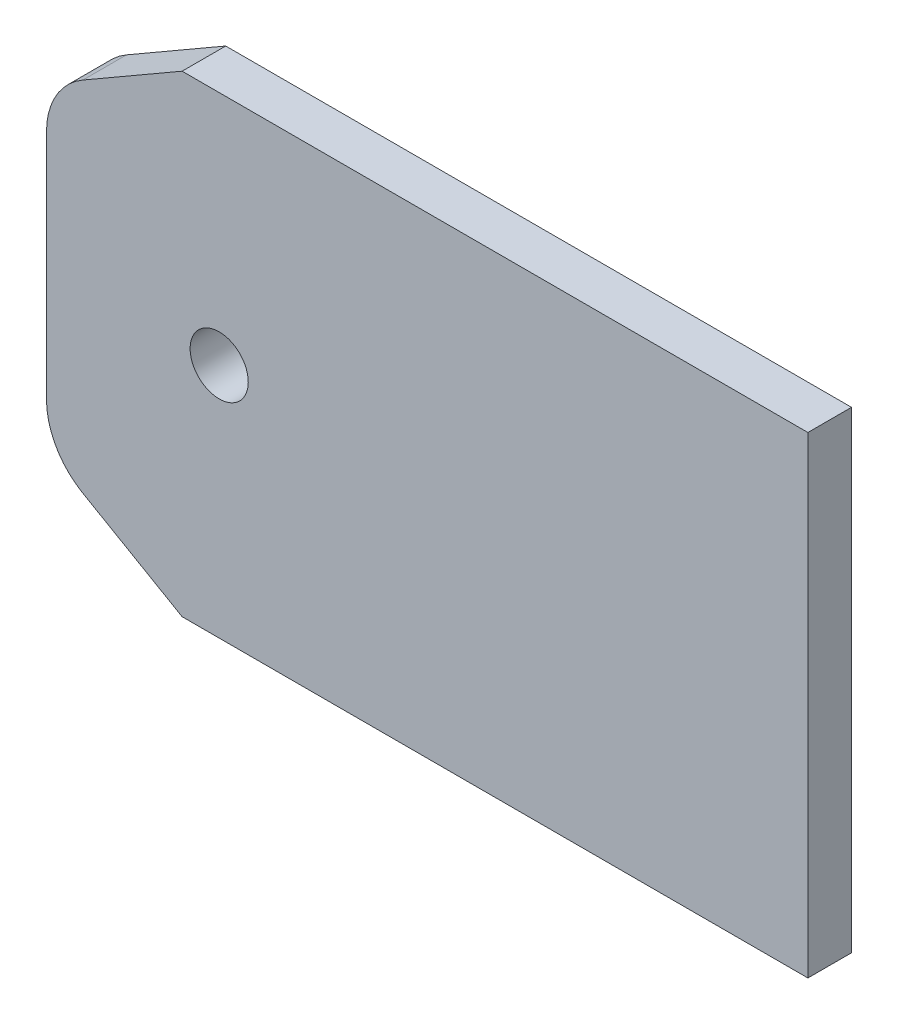
ISO-10303-21;
HEADER;
FILE_DESCRIPTION(('STEP AP214'),'2;1');
FILE_NAME('part.step','',(''),(''),'','','');
FILE_SCHEMA(('AUTOMOTIVE_DESIGN { 1 0 10303 214 1 1 1 1 }'));
ENDSEC;
DATA;
#1=APPLICATION_CONTEXT('core data for automotive mechanical design processes');
#2=APPLICATION_PROTOCOL_DEFINITION('international standard','automotive_design',2000,#1);
#3=PRODUCT_CONTEXT('',#1,'mechanical');
#4=PRODUCT('Part','Part','',(#3));
#5=PRODUCT_RELATED_PRODUCT_CATEGORY('part','',(#4));
#6=PRODUCT_DEFINITION_FORMATION('','',#4);
#7=PRODUCT_DEFINITION_CONTEXT('part definition',#1,'design');
#8=PRODUCT_DEFINITION('design','',#6,#7);
#9=PRODUCT_DEFINITION_SHAPE('','',#8);
#10=(LENGTH_UNIT() NAMED_UNIT(*) SI_UNIT(.MILLI.,.METRE.));
#11=(NAMED_UNIT(*) PLANE_ANGLE_UNIT() SI_UNIT($,.RADIAN.));
#12=(NAMED_UNIT(*) SI_UNIT($,.STERADIAN.) SOLID_ANGLE_UNIT());
#13=UNCERTAINTY_MEASURE_WITH_UNIT(LENGTH_MEASURE(1.E-05),#10,'distance_accuracy_value','');
#14=(GEOMETRIC_REPRESENTATION_CONTEXT(3) GLOBAL_UNCERTAINTY_ASSIGNED_CONTEXT((#13)) GLOBAL_UNIT_ASSIGNED_CONTEXT((#10,
#11,#12)) REPRESENTATION_CONTEXT('',''));
#15=CARTESIAN_POINT('',(0.,0.,0.));
#16=DIRECTION('',(0.,0.,1.));
#17=DIRECTION('',(1.,0.,0.));
#18=AXIS2_PLACEMENT_3D('',#15,#16,#17);
#19=CARTESIAN_POINT('',(-132.545348636801,291.387576410757,6.));
#20=DIRECTION('',(0.,0.,1.));
#21=DIRECTION('',(1.,0.,0.));
#22=AXIS2_PLACEMENT_3D('',#19,#20,#21);
#23=PLANE('',#22);
#24=DIRECTION('',(0.,1.,0.));
#25=VECTOR('',#24,1.);
#26=CARTESIAN_POINT('',(-37.7876425318327,242.932576410757,6.));
#27=LINE('',#26,#25);
#28=CARTESIAN_POINT('',(-37.7876425318327,242.932576410757,6.));
#29=VERTEX_POINT('',#28);
#30=CARTESIAN_POINT('',(-37.7876425318328,307.932576410758,6.));
#31=VERTEX_POINT('',#30);
#32=EDGE_CURVE('E154',#29,#31,#27,.T.);
#33=ORIENTED_EDGE('',*,*,#32,.T.);
#34=DIRECTION('',(-1.,0.,0.));
#35=VECTOR('',#34,1.);
#36=CARTESIAN_POINT('',(-37.7876425318328,307.932576410758,6.));
#37=LINE('',#36,#35);
#38=CARTESIAN_POINT('',(-123.887642531833,307.932576410757,6.));
#39=VERTEX_POINT('',#38);
#40=EDGE_CURVE('E102',#31,#39,#37,.T.);
#41=ORIENTED_EDGE('',*,*,#40,.T.);
#42=DIRECTION('',(-0.866040075021153,-0.499974587811576,0.));
#43=VECTOR('',#42,1.);
#44=CARTESIAN_POINT('',(-123.887642531833,307.932576410757,6.));
#45=LINE('',#44,#43);
#46=CARTESIAN_POINT('',(-137.545094514916,300.047977160969,6.));
#47=VERTEX_POINT('',#46);
#48=EDGE_CURVE('E169',#39,#47,#45,.T.);
#49=ORIENTED_EDGE('',*,*,#48,.T.);
#50=CARTESIAN_POINT('',(-132.545348636801,291.387576410757,6.));
#51=DIRECTION('',(0.,0.,1.));
#52=DIRECTION('',(1.,0.,0.));
#53=AXIS2_PLACEMENT_3D('',#50,#51,#52);
#54=CIRCLE('',#53,9.99999999999996);
#55=CARTESIAN_POINT('',(-142.545348636801,291.387576410757,6.));
#56=VERTEX_POINT('',#55);
#57=EDGE_CURVE('E182',#47,#56,#54,.T.);
#58=ORIENTED_EDGE('',*,*,#57,.T.);
#59=DIRECTION('',(0.,-1.,0.));
#60=VECTOR('',#59,1.);
#61=CARTESIAN_POINT('',(-142.545348636801,259.477576410757,6.));
#62=LINE('',#61,#60);
#63=CARTESIAN_POINT('',(-142.545348636801,259.477576410757,6.));
#64=VERTEX_POINT('',#63);
#65=EDGE_CURVE('E121',#56,#64,#62,.T.);
#66=ORIENTED_EDGE('',*,*,#65,.T.);
#67=CARTESIAN_POINT('',(-132.545348636801,259.477576410757,6.));
#68=DIRECTION('',(0.,0.,1.));
#69=DIRECTION('',(-1.,0.,0.));
#70=AXIS2_PLACEMENT_3D('',#67,#68,#69);
#71=CIRCLE('',#70,10.);
#72=CARTESIAN_POINT('',(-137.545094514916,250.817175660545,6.));
#73=VERTEX_POINT('',#72);
#74=EDGE_CURVE('E115',#64,#73,#71,.T.);
#75=ORIENTED_EDGE('',*,*,#74,.T.);
#76=DIRECTION('',(0.866040075021156,-0.499974587811572,0.));
#77=VECTOR('',#76,1.);
#78=CARTESIAN_POINT('',(-123.887642531833,242.932576410757,6.));
#79=LINE('',#78,#77);
#80=CARTESIAN_POINT('',(-123.887642531833,242.932576410757,6.));
#81=VERTEX_POINT('',#80);
#82=EDGE_CURVE('E119',#73,#81,#79,.T.);
#83=ORIENTED_EDGE('',*,*,#82,.T.);
#84=DIRECTION('',(1.,0.,0.));
#85=VECTOR('',#84,1.);
#86=CARTESIAN_POINT('',(-37.7876425318327,242.932576410757,6.));
#87=LINE('',#86,#85);
#88=EDGE_CURVE('E59',#81,#29,#87,.T.);
#89=ORIENTED_EDGE('',*,*,#88,.T.);
#90=EDGE_LOOP('',(#33,#41,#49,#58,#66,#75,#83,#89));
#91=FACE_BOUND('',#90,.T.);
#92=CARTESIAN_POINT('',(-118.785348636801,275.432576410758,6.));
#93=DIRECTION('',(0.,0.,1.));
#94=DIRECTION('',(1.,0.,0.));
#95=AXIS2_PLACEMENT_3D('',#92,#93,#94);
#96=CIRCLE('',#95,3.99999999999983);
#97=CARTESIAN_POINT('',(-114.785348636801,275.432576410758,6.));
#98=VERTEX_POINT('',#97);
#99=EDGE_CURVE('E143',#98,#98,#96,.T.);
#100=ORIENTED_EDGE('',*,*,#99,.F.);
#101=EDGE_LOOP('',(#100));
#102=FACE_BOUND('',#101,.T.);
#103=ADVANCED_FACE('F42',(#91,#102),#23,.T.);
#104=CARTESIAN_POINT('',(-132.545348636801,291.387576410757,0.));
#105=DIRECTION('',(0.,0.,1.));
#106=DIRECTION('',(1.,0.,0.));
#107=AXIS2_PLACEMENT_3D('',#104,#105,#106);
#108=PLANE('',#107);
#109=DIRECTION('',(0.,1.,0.));
#110=VECTOR('',#109,1.);
#111=CARTESIAN_POINT('',(-37.7876425318327,242.932576410757,0.));
#112=LINE('',#111,#110);
#113=CARTESIAN_POINT('',(-37.7876425318327,242.932576410757,0.));
#114=VERTEX_POINT('',#113);
#115=CARTESIAN_POINT('',(-37.7876425318328,307.932576410758,0.));
#116=VERTEX_POINT('',#115);
#117=EDGE_CURVE('E139',#114,#116,#112,.T.);
#118=ORIENTED_EDGE('',*,*,#117,.F.);
#119=DIRECTION('',(1.,0.,0.));
#120=VECTOR('',#119,1.);
#121=CARTESIAN_POINT('',(-37.7876425318327,242.932576410757,0.));
#122=LINE('',#121,#120);
#123=CARTESIAN_POINT('',(-123.887642531833,242.932576410757,0.));
#124=VERTEX_POINT('',#123);
#125=EDGE_CURVE('E94',#124,#114,#122,.T.);
#126=ORIENTED_EDGE('',*,*,#125,.F.);
#127=DIRECTION('',(0.866040075021156,-0.499974587811572,0.));
#128=VECTOR('',#127,1.);
#129=CARTESIAN_POINT('',(-123.887642531833,242.932576410757,0.));
#130=LINE('',#129,#128);
#131=CARTESIAN_POINT('',(-137.545094514916,250.817175660545,0.));
#132=VERTEX_POINT('',#131);
#133=EDGE_CURVE('E88',#132,#124,#130,.T.);
#134=ORIENTED_EDGE('',*,*,#133,.F.);
#135=CARTESIAN_POINT('',(-132.545348636801,259.477576410757,0.));
#136=DIRECTION('',(0.,0.,1.));
#137=DIRECTION('',(-1.,0.,0.));
#138=AXIS2_PLACEMENT_3D('',#135,#136,#137);
#139=CIRCLE('',#138,10.);
#140=CARTESIAN_POINT('',(-142.545348636801,259.477576410757,0.));
#141=VERTEX_POINT('',#140);
#142=EDGE_CURVE('E129',#141,#132,#139,.T.);
#143=ORIENTED_EDGE('',*,*,#142,.F.);
#144=DIRECTION('',(0.,-1.,0.));
#145=VECTOR('',#144,1.);
#146=CARTESIAN_POINT('',(-142.545348636801,259.477576410757,0.));
#147=LINE('',#146,#145);
#148=CARTESIAN_POINT('',(-142.545348636801,291.387576410757,0.));
#149=VERTEX_POINT('',#148);
#150=EDGE_CURVE('E149',#149,#141,#147,.T.);
#151=ORIENTED_EDGE('',*,*,#150,.F.);
#152=CARTESIAN_POINT('',(-132.545348636801,291.387576410757,0.));
#153=DIRECTION('',(0.,0.,1.));
#154=DIRECTION('',(1.,0.,0.));
#155=AXIS2_PLACEMENT_3D('',#152,#153,#154);
#156=CIRCLE('',#155,9.99999999999996);
#157=CARTESIAN_POINT('',(-137.545094514916,300.047977160969,0.));
#158=VERTEX_POINT('',#157);
#159=EDGE_CURVE('E147',#158,#149,#156,.T.);
#160=ORIENTED_EDGE('',*,*,#159,.F.);
#161=DIRECTION('',(-0.866040075021153,-0.499974587811576,0.));
#162=VECTOR('',#161,1.);
#163=CARTESIAN_POINT('',(-123.887642531833,307.932576410757,0.));
#164=LINE('',#163,#162);
#165=CARTESIAN_POINT('',(-123.887642531833,307.932576410757,0.));
#166=VERTEX_POINT('',#165);
#167=EDGE_CURVE('E145',#166,#158,#164,.T.);
#168=ORIENTED_EDGE('',*,*,#167,.F.);
#169=DIRECTION('',(-1.,0.,0.));
#170=VECTOR('',#169,1.);
#171=CARTESIAN_POINT('',(-37.7876425318328,307.932576410758,0.));
#172=LINE('',#171,#170);
#173=EDGE_CURVE('E142',#116,#166,#172,.T.);
#174=ORIENTED_EDGE('',*,*,#173,.F.);
#175=EDGE_LOOP('',(#118,#126,#134,#143,#151,#160,#168,#174));
#176=FACE_BOUND('',#175,.T.);
#177=CARTESIAN_POINT('',(-118.785348636801,275.432576410758,0.));
#178=DIRECTION('',(0.,0.,1.));
#179=DIRECTION('',(1.,0.,0.));
#180=AXIS2_PLACEMENT_3D('',#177,#178,#179);
#181=CIRCLE('',#180,3.99999999999983);
#182=CARTESIAN_POINT('',(-114.785348636801,275.432576410758,0.));
#183=VERTEX_POINT('',#182);
#184=EDGE_CURVE('E188',#183,#183,#181,.T.);
#185=ORIENTED_EDGE('',*,*,#184,.T.);
#186=EDGE_LOOP('',(#185));
#187=FACE_BOUND('',#186,.T.);
#188=ADVANCED_FACE('F173',(#176,#187),#108,.F.);
#189=CARTESIAN_POINT('',(-37.7876425318327,242.932576410757,6.));
#190=DIRECTION('',(-1.,0.,0.));
#191=DIRECTION('',(0.,-1.,0.));
#192=AXIS2_PLACEMENT_3D('',#189,#190,#191);
#193=PLANE('',#192);
#194=ORIENTED_EDGE('',*,*,#117,.T.);
#195=DIRECTION('',(0.,0.,-1.));
#196=VECTOR('',#195,1.);
#197=CARTESIAN_POINT('',(-37.7876425318328,307.932576410758,6.));
#198=LINE('',#197,#196);
#199=EDGE_CURVE('E11',#31,#116,#198,.T.);
#200=ORIENTED_EDGE('',*,*,#199,.F.);
#201=ORIENTED_EDGE('',*,*,#32,.F.);
#202=DIRECTION('',(0.,0.,-1.));
#203=VECTOR('',#202,1.);
#204=CARTESIAN_POINT('',(-37.7876425318327,242.932576410757,6.));
#205=LINE('',#204,#203);
#206=EDGE_CURVE('E135',#29,#114,#205,.T.);
#207=ORIENTED_EDGE('',*,*,#206,.T.);
#208=EDGE_LOOP('',(#194,#200,#201,#207));
#209=FACE_BOUND('',#208,.T.);
#210=ADVANCED_FACE('F44',(#209),#193,.F.);
#211=CARTESIAN_POINT('',(-37.7876425318328,307.932576410758,6.));
#212=DIRECTION('',(0.,-1.,0.));
#213=DIRECTION('',(1.,0.,0.));
#214=AXIS2_PLACEMENT_3D('',#211,#212,#213);
#215=PLANE('',#214);
#216=ORIENTED_EDGE('',*,*,#173,.T.);
#217=DIRECTION('',(0.,0.,-1.));
#218=VECTOR('',#217,1.);
#219=CARTESIAN_POINT('',(-123.887642531833,307.932576410757,6.));
#220=LINE('',#219,#218);
#221=EDGE_CURVE('E51',#39,#166,#220,.T.);
#222=ORIENTED_EDGE('',*,*,#221,.F.);
#223=ORIENTED_EDGE('',*,*,#40,.F.);
#224=ORIENTED_EDGE('',*,*,#199,.T.);
#225=EDGE_LOOP('',(#216,#222,#223,#224));
#226=FACE_BOUND('',#225,.T.);
#227=ADVANCED_FACE('F216',(#226),#215,.F.);
#228=CARTESIAN_POINT('',(-123.887642531833,307.932576410757,6.));
#229=DIRECTION('',(0.499974587811576,-0.866040075021153,0.));
#230=DIRECTION('',(0.866040075021153,0.499974587811576,0.));
#231=AXIS2_PLACEMENT_3D('',#228,#229,#230);
#232=PLANE('',#231);
#233=ORIENTED_EDGE('',*,*,#167,.T.);
#234=DIRECTION('',(0.,0.,-1.));
#235=VECTOR('',#234,1.);
#236=CARTESIAN_POINT('',(-137.545094514916,300.047977160969,6.));
#237=LINE('',#236,#235);
#238=EDGE_CURVE('E161',#47,#158,#237,.T.);
#239=ORIENTED_EDGE('',*,*,#238,.F.);
#240=ORIENTED_EDGE('',*,*,#48,.F.);
#241=ORIENTED_EDGE('',*,*,#221,.T.);
#242=EDGE_LOOP('',(#233,#239,#240,#241));
#243=FACE_BOUND('',#242,.T.);
#244=ADVANCED_FACE('F167',(#243),#232,.F.);
#245=CARTESIAN_POINT('',(-132.545348636801,291.387576410757,6.));
#246=DIRECTION('',(0.,0.,-1.));
#247=DIRECTION('',(-1.,0.,0.));
#248=AXIS2_PLACEMENT_3D('',#245,#246,#247);
#249=CYLINDRICAL_SURFACE('',#248,9.99999999999996);
#250=ORIENTED_EDGE('',*,*,#159,.T.);
#251=DIRECTION('',(0.,0.,-1.));
#252=VECTOR('',#251,1.);
#253=CARTESIAN_POINT('',(-142.545348636801,291.387576410757,6.));
#254=LINE('',#253,#252);
#255=EDGE_CURVE('E158',#56,#149,#254,.T.);
#256=ORIENTED_EDGE('',*,*,#255,.F.);
#257=ORIENTED_EDGE('',*,*,#57,.F.);
#258=ORIENTED_EDGE('',*,*,#238,.T.);
#259=EDGE_LOOP('',(#250,#256,#257,#258));
#260=FACE_BOUND('',#259,.T.);
#261=ADVANCED_FACE('F178',(#260),#249,.T.);
#262=CARTESIAN_POINT('',(-142.545348636801,259.477576410757,6.));
#263=DIRECTION('',(1.,0.,0.));
#264=DIRECTION('',(0.,0.,-1.));
#265=AXIS2_PLACEMENT_3D('',#262,#263,#264);
#266=PLANE('',#265);
#267=ORIENTED_EDGE('',*,*,#150,.T.);
#268=DIRECTION('',(0.,0.,-1.));
#269=VECTOR('',#268,1.);
#270=CARTESIAN_POINT('',(-142.545348636801,259.477576410757,6.));
#271=LINE('',#270,#269);
#272=EDGE_CURVE('E130',#64,#141,#271,.T.);
#273=ORIENTED_EDGE('',*,*,#272,.F.);
#274=ORIENTED_EDGE('',*,*,#65,.F.);
#275=ORIENTED_EDGE('',*,*,#255,.T.);
#276=EDGE_LOOP('',(#267,#273,#274,#275));
#277=FACE_BOUND('',#276,.T.);
#278=ADVANCED_FACE('F181',(#277),#266,.F.);
#279=CARTESIAN_POINT('',(-132.545348636801,259.477576410757,6.));
#280=DIRECTION('',(0.,0.,-1.));
#281=DIRECTION('',(-1.,0.,0.));
#282=AXIS2_PLACEMENT_3D('',#279,#280,#281);
#283=CYLINDRICAL_SURFACE('',#282,10.);
#284=ORIENTED_EDGE('',*,*,#142,.T.);
#285=DIRECTION('',(0.,0.,-1.));
#286=VECTOR('',#285,1.);
#287=CARTESIAN_POINT('',(-137.545094514916,250.817175660545,6.));
#288=LINE('',#287,#286);
#289=EDGE_CURVE('E126',#73,#132,#288,.T.);
#290=ORIENTED_EDGE('',*,*,#289,.F.);
#291=ORIENTED_EDGE('',*,*,#74,.F.);
#292=ORIENTED_EDGE('',*,*,#272,.T.);
#293=EDGE_LOOP('',(#284,#290,#291,#292));
#294=FACE_BOUND('',#293,.T.);
#295=ADVANCED_FACE('F127',(#294),#283,.T.);
#296=CARTESIAN_POINT('',(-123.887642531833,242.932576410757,6.));
#297=DIRECTION('',(0.499974587811572,0.866040075021156,0.));
#298=DIRECTION('',(-0.866040075021156,0.499974587811572,0.));
#299=AXIS2_PLACEMENT_3D('',#296,#297,#298);
#300=PLANE('',#299);
#301=ORIENTED_EDGE('',*,*,#133,.T.);
#302=DIRECTION('',(0.,0.,-1.));
#303=VECTOR('',#302,1.);
#304=CARTESIAN_POINT('',(-123.887642531833,242.932576410757,6.));
#305=LINE('',#304,#303);
#306=EDGE_CURVE('E131',#81,#124,#305,.T.);
#307=ORIENTED_EDGE('',*,*,#306,.F.);
#308=ORIENTED_EDGE('',*,*,#82,.F.);
#309=ORIENTED_EDGE('',*,*,#289,.T.);
#310=EDGE_LOOP('',(#301,#307,#308,#309));
#311=FACE_BOUND('',#310,.T.);
#312=ADVANCED_FACE('F133',(#311),#300,.F.);
#313=CARTESIAN_POINT('',(-37.7876425318327,242.932576410757,6.));
#314=DIRECTION('',(0.,1.,0.));
#315=DIRECTION('',(-1.,0.,0.));
#316=AXIS2_PLACEMENT_3D('',#313,#314,#315);
#317=PLANE('',#316);
#318=ORIENTED_EDGE('',*,*,#125,.T.);
#319=ORIENTED_EDGE('',*,*,#206,.F.);
#320=ORIENTED_EDGE('',*,*,#88,.F.);
#321=ORIENTED_EDGE('',*,*,#306,.T.);
#322=EDGE_LOOP('',(#318,#319,#320,#321));
#323=FACE_BOUND('',#322,.T.);
#324=ADVANCED_FACE('F204',(#323),#317,.F.);
#325=CARTESIAN_POINT('',(-118.785348636801,275.432576410758,6.));
#326=DIRECTION('',(0.,0.,-1.));
#327=DIRECTION('',(-1.,0.,0.));
#328=AXIS2_PLACEMENT_3D('',#325,#326,#327);
#329=CYLINDRICAL_SURFACE('',#328,3.99999999999983);
#330=ORIENTED_EDGE('',*,*,#99,.T.);
#331=EDGE_LOOP('',(#330));
#332=FACE_BOUND('',#331,.T.);
#333=ORIENTED_EDGE('',*,*,#184,.F.);
#334=EDGE_LOOP('',(#333));
#335=FACE_BOUND('',#334,.T.);
#336=ADVANCED_FACE('F194',(#332,#335),#329,.F.);
#337=CLOSED_SHELL('',(#103,#188,#210,#227,#244,#261,#278,#295,#312,#324,#336));
#338=MANIFOLD_SOLID_BREP('B2',#337);
#339=ADVANCED_BREP_SHAPE_REPRESENTATION('',(#18,#338),#14);
#340=SHAPE_DEFINITION_REPRESENTATION(#9,#339);
ENDSEC;
END-ISO-10303-21;
